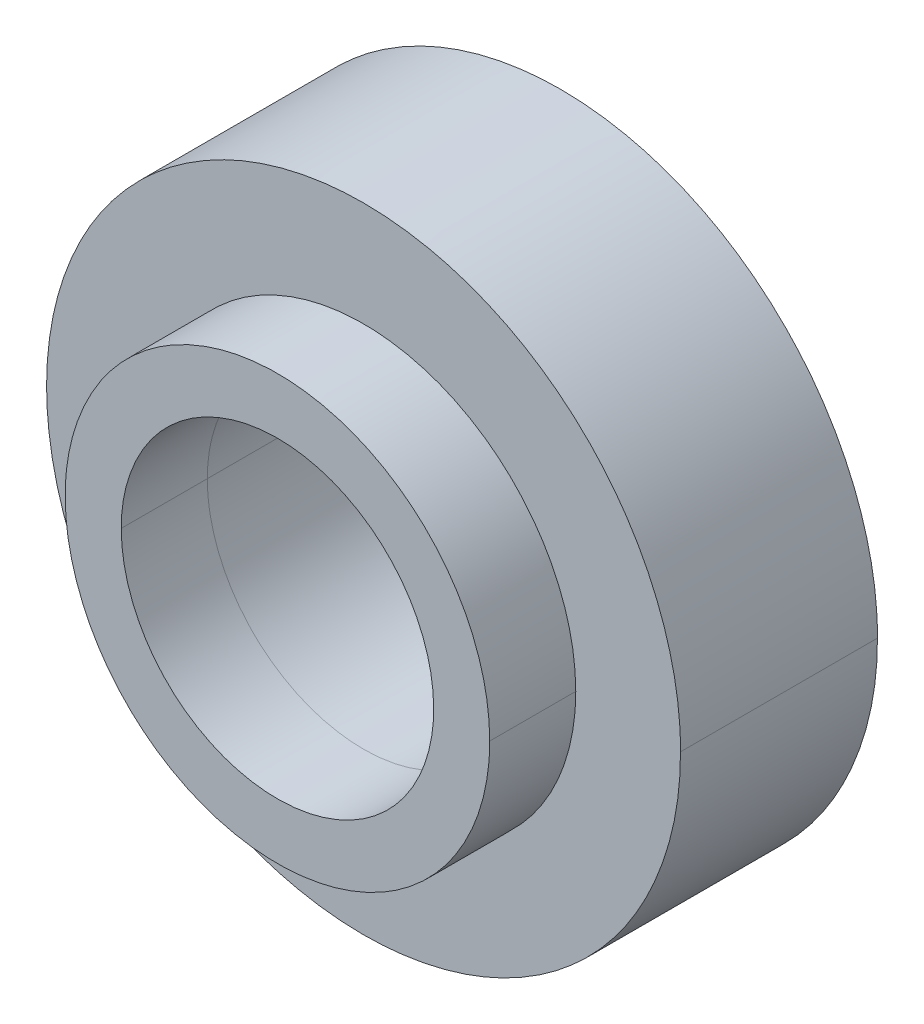
ISO-10303-21;
HEADER;
FILE_DESCRIPTION(('STEP AP214'),'2;1');
FILE_NAME('part.step','',(''),(''),'','','');
FILE_SCHEMA(('AUTOMOTIVE_DESIGN { 1 0 10303 214 1 1 1 1 }'));
ENDSEC;
DATA;
#1=APPLICATION_CONTEXT('core data for automotive mechanical design processes');
#2=APPLICATION_PROTOCOL_DEFINITION('international standard','automotive_design',2000,#1);
#3=PRODUCT_CONTEXT('',#1,'mechanical');
#4=PRODUCT('Part','Part','',(#3));
#5=PRODUCT_RELATED_PRODUCT_CATEGORY('part','',(#4));
#6=PRODUCT_DEFINITION_FORMATION('','',#4);
#7=PRODUCT_DEFINITION_CONTEXT('part definition',#1,'design');
#8=PRODUCT_DEFINITION('design','',#6,#7);
#9=PRODUCT_DEFINITION_SHAPE('','',#8);
#10=(LENGTH_UNIT() NAMED_UNIT(*) SI_UNIT(.MILLI.,.METRE.));
#11=(NAMED_UNIT(*) PLANE_ANGLE_UNIT() SI_UNIT($,.RADIAN.));
#12=(NAMED_UNIT(*) SI_UNIT($,.STERADIAN.) SOLID_ANGLE_UNIT());
#13=UNCERTAINTY_MEASURE_WITH_UNIT(LENGTH_MEASURE(1.E-05),#10,'distance_accuracy_value','');
#14=(GEOMETRIC_REPRESENTATION_CONTEXT(3) GLOBAL_UNCERTAINTY_ASSIGNED_CONTEXT((#13)) GLOBAL_UNIT_ASSIGNED_CONTEXT((#10,
#11,#12)) REPRESENTATION_CONTEXT('',''));
#15=CARTESIAN_POINT('',(0.,0.,0.));
#16=DIRECTION('',(0.,0.,1.));
#17=DIRECTION('',(1.,0.,0.));
#18=AXIS2_PLACEMENT_3D('',#15,#16,#17);
#19=CARTESIAN_POINT('',(388.289799999992,295.687749999996,40.9956));
#20=CARTESIAN_POINT('',(388.289799999991,296.060113055016,40.9956));
#21=CARTESIAN_POINT('',(388.407752994343,296.804839165051,40.9956));
#22=CARTESIAN_POINT('',(388.921222688105,297.812579931764,40.9956));
#23=CARTESIAN_POINT('',(389.720969661226,298.612327250808,40.9956));
#24=CARTESIAN_POINT('',(390.728712524096,299.125797656962,40.9956));
#25=CARTESIAN_POINT('',(391.845793650406,299.302723952994,40.9956));
#26=CARTESIAN_POINT('',(392.962912874279,299.125806531011,40.9956));
#27=CARTESIAN_POINT('',(393.970541444514,298.612291754613,40.9956));
#28=CARTESIAN_POINT('',(394.77070749061,297.812713042496,40.9956));
#29=CARTESIAN_POINT('',(395.28261518503,296.804342218297,40.9956));
#30=CARTESIAN_POINT('',(395.404454128956,296.061183856966,40.9956));
#31=CARTESIAN_POINT('',(395.4018,295.68775,40.9956));
#32=(BOUNDED_CURVE() B_SPLINE_CURVE(3,(#19,#20,#21,#22,#23,#24,#25,#26,#27,#28,#29,#30,#31),
.UNSPECIFIED.,.F.,.F.) B_SPLINE_CURVE_WITH_KNOTS((4,1,1,1,1,1,1,1,1,1,4),(0.438016502113,
0.481818152324,0.525619802535,0.569421452746,0.613223102958,0.657024753169,0.70082640338,
0.744628053591,0.788429703803,0.832231354014,0.876033004225),
.UNSPECIFIED.) CURVE() GEOMETRIC_REPRESENTATION_ITEM() RATIONAL_B_SPLINE_CURVE((1.,1.,1.,1.,1.,
1.,1.,1.,1.,1.,1.,1.,1.)) REPRESENTATION_ITEM(''));
#33=DIRECTION('',(0.,0.,1.));
#34=VECTOR('',#33,1.);
#35=SURFACE_OF_LINEAR_EXTRUSION('',#32,#34);
#36=DIRECTION('',(0.,0.,1.));
#37=VECTOR('',#36,1.);
#38=CARTESIAN_POINT('',(395.4018,295.68775,40.9956));
#39=LINE('',#38,#37);
#40=CARTESIAN_POINT('',(395.4018,295.68775,38.7858));
#41=VERTEX_POINT('',#40);
#42=CARTESIAN_POINT('',(395.4018,295.68775,40.9956));
#43=VERTEX_POINT('',#42);
#44=EDGE_CURVE('E11',#41,#43,#39,.T.);
#45=ORIENTED_EDGE('',*,*,#44,.F.);
#46=CARTESIAN_POINT('',(388.289799999992,295.687749999996,38.7858));
#47=CARTESIAN_POINT('',(388.289799999991,296.060113055016,38.7858));
#48=CARTESIAN_POINT('',(388.407752994343,296.804839165051,38.7858));
#49=CARTESIAN_POINT('',(388.921222688105,297.812579931764,38.7858));
#50=CARTESIAN_POINT('',(389.720969661226,298.612327250808,38.7858));
#51=CARTESIAN_POINT('',(390.728712524096,299.125797656962,38.7858));
#52=CARTESIAN_POINT('',(391.845793650406,299.302723952994,38.7858));
#53=CARTESIAN_POINT('',(392.962912874279,299.125806531011,38.7858));
#54=CARTESIAN_POINT('',(393.970541444514,298.612291754613,38.7858));
#55=CARTESIAN_POINT('',(394.77070749061,297.812713042496,38.7858));
#56=CARTESIAN_POINT('',(395.28261518503,296.804342218297,38.7858));
#57=CARTESIAN_POINT('',(395.404454128956,296.061183856966,38.7858));
#58=CARTESIAN_POINT('',(395.4018,295.68775,38.7858));
#59=(BOUNDED_CURVE() B_SPLINE_CURVE(3,(#46,#47,#48,#49,#50,#51,#52,#53,#54,#55,#56,#57,#58),
.UNSPECIFIED.,.F.,.F.) B_SPLINE_CURVE_WITH_KNOTS((4,1,1,1,1,1,1,1,1,1,4),(0.438016502113,
0.481818152324,0.525619802535,0.569421452746,0.613223102958,0.657024753169,0.70082640338,
0.744628053591,0.788429703803,0.832231354014,0.876033004225),
.UNSPECIFIED.) CURVE() GEOMETRIC_REPRESENTATION_ITEM() RATIONAL_B_SPLINE_CURVE((1.,1.,1.,1.,1.,
1.,1.,1.,1.,1.,1.,1.,1.)) REPRESENTATION_ITEM(''));
#60=CARTESIAN_POINT('',(388.289799999992,295.687749999996,38.7858));
#61=VERTEX_POINT('',#60);
#62=EDGE_CURVE('E215',#61,#41,#59,.T.);
#63=ORIENTED_EDGE('',*,*,#62,.F.);
#64=DIRECTION('',(0.,0.,1.));
#65=VECTOR('',#64,1.);
#66=CARTESIAN_POINT('',(388.289799999992,295.687749999996,40.9956));
#67=LINE('',#66,#65);
#68=CARTESIAN_POINT('',(388.289799999992,295.687749999996,40.9956));
#69=VERTEX_POINT('',#68);
#70=EDGE_CURVE('E28',#61,#69,#67,.T.);
#71=ORIENTED_EDGE('',*,*,#70,.T.);
#72=CARTESIAN_POINT('',(388.289799999992,295.687749999996,40.9956));
#73=CARTESIAN_POINT('',(388.289799999991,296.060113055016,40.9956));
#74=CARTESIAN_POINT('',(388.407752994343,296.804839165051,40.9956));
#75=CARTESIAN_POINT('',(388.921222688105,297.812579931764,40.9956));
#76=CARTESIAN_POINT('',(389.720969661226,298.612327250808,40.9956));
#77=CARTESIAN_POINT('',(390.728712524096,299.125797656962,40.9956));
#78=CARTESIAN_POINT('',(391.845793650406,299.302723952994,40.9956));
#79=CARTESIAN_POINT('',(392.962912874279,299.125806531011,40.9956));
#80=CARTESIAN_POINT('',(393.970541444514,298.612291754613,40.9956));
#81=CARTESIAN_POINT('',(394.77070749061,297.812713042496,40.9956));
#82=CARTESIAN_POINT('',(395.28261518503,296.804342218297,40.9956));
#83=CARTESIAN_POINT('',(395.404454128956,296.061183856966,40.9956));
#84=CARTESIAN_POINT('',(395.4018,295.68775,40.9956));
#85=(BOUNDED_CURVE() B_SPLINE_CURVE(3,(#72,#73,#74,#75,#76,#77,#78,#79,#80,#81,#82,#83,#84),
.UNSPECIFIED.,.F.,.F.) B_SPLINE_CURVE_WITH_KNOTS((4,1,1,1,1,1,1,1,1,1,4),(0.438016502113,
0.481818152324,0.525619802535,0.569421452746,0.613223102958,0.657024753169,0.70082640338,
0.744628053591,0.788429703803,0.832231354014,0.876033004225),
.UNSPECIFIED.) CURVE() GEOMETRIC_REPRESENTATION_ITEM() RATIONAL_B_SPLINE_CURVE((1.,1.,1.,1.,1.,
1.,1.,1.,1.,1.,1.,1.,1.)) REPRESENTATION_ITEM(''));
#86=EDGE_CURVE('E218',#43,#69,#85,.F.);
#87=ORIENTED_EDGE('',*,*,#86,.F.);
#88=EDGE_LOOP('',(#45,#63,#71,#87));
#89=FACE_BOUND('',#88,.T.);
#90=ADVANCED_FACE('F17',(#89),#35,.F.);
#91=CARTESIAN_POINT('',(394.22705,295.687750000011,40.9956));
#92=CARTESIAN_POINT('',(394.227049999999,295.937100260063,40.9956));
#93=CARTESIAN_POINT('',(394.148063619846,296.435800780176,40.9956));
#94=CARTESIAN_POINT('',(393.804222307074,297.110627186447,40.9956));
#95=CARTESIAN_POINT('',(393.268677459015,297.64617226618,40.9956));
#96=CARTESIAN_POINT('',(392.593849649034,297.990014055991,40.9956));
#97=CARTESIAN_POINT('',(391.84580425196,298.108491486397,40.9956));
#98=CARTESIAN_POINT('',(391.097733343126,297.990019998448,40.9956));
#99=CARTESIAN_POINT('',(390.4229820684,297.646148496403,40.9956));
#100=CARTESIAN_POINT('',(389.887156591107,297.110716323099,40.9956));
#101=CARTESIAN_POINT('',(389.544361260011,296.435468003316,40.9956));
#102=CARTESIAN_POINT('',(389.462772681507,295.937817314952,40.9956));
#103=CARTESIAN_POINT('',(389.46455,295.68775,40.9956));
#104=(BOUNDED_CURVE() B_SPLINE_CURVE(3,(#91,#92,#93,#94,#95,#96,#97,#98,#99,#100,#101,#102,
#103),.UNSPECIFIED.,.F.,.F.) B_SPLINE_CURVE_WITH_KNOTS((4,1,1,1,1,1,1,1,1,1,4),(0.29331462195,
0.322646084145,0.351977546341,0.381309008536,0.410640470731,0.439971932926,0.469303395121,
0.498634857316,0.527966319511,0.557297781706,0.586629243901),
.UNSPECIFIED.) CURVE() GEOMETRIC_REPRESENTATION_ITEM() RATIONAL_B_SPLINE_CURVE((1.,1.,1.,1.,1.,
1.,1.,1.,1.,1.,1.,1.,1.)) REPRESENTATION_ITEM(''));
#105=DIRECTION('',(0.,0.,-1.));
#106=VECTOR('',#105,1.);
#107=SURFACE_OF_LINEAR_EXTRUSION('',#104,#106);
#108=DIRECTION('',(0.,0.,-1.));
#109=VECTOR('',#108,1.);
#110=CARTESIAN_POINT('',(389.46455,295.68775,40.9956));
#111=LINE('',#110,#109);
#112=CARTESIAN_POINT('',(389.46455,295.68775,41.9608));
#113=VERTEX_POINT('',#112);
#114=CARTESIAN_POINT('',(389.46455,295.68775,40.9956));
#115=VERTEX_POINT('',#114);
#116=EDGE_CURVE('E179',#113,#115,#111,.T.);
#117=ORIENTED_EDGE('',*,*,#116,.F.);
#118=CARTESIAN_POINT('',(394.22705,295.687750000011,41.9608));
#119=CARTESIAN_POINT('',(394.227049999999,295.937100260063,41.9608));
#120=CARTESIAN_POINT('',(394.148063619846,296.435800780176,41.9608));
#121=CARTESIAN_POINT('',(393.804222307074,297.110627186447,41.9608));
#122=CARTESIAN_POINT('',(393.268677459015,297.64617226618,41.9608));
#123=CARTESIAN_POINT('',(392.593849649034,297.990014055991,41.9608));
#124=CARTESIAN_POINT('',(391.84580425196,298.108491486397,41.9608));
#125=CARTESIAN_POINT('',(391.097733343126,297.990019998448,41.9608));
#126=CARTESIAN_POINT('',(390.4229820684,297.646148496403,41.9608));
#127=CARTESIAN_POINT('',(389.887156591107,297.110716323099,41.9608));
#128=CARTESIAN_POINT('',(389.544361260011,296.435468003316,41.9608));
#129=CARTESIAN_POINT('',(389.462772681507,295.937817314952,41.9608));
#130=CARTESIAN_POINT('',(389.46455,295.68775,41.9608));
#131=(BOUNDED_CURVE() B_SPLINE_CURVE(3,(#118,#119,#120,#121,#122,#123,#124,#125,#126,#127,#128,
#129,#130),.UNSPECIFIED.,.F.,.F.) B_SPLINE_CURVE_WITH_KNOTS((4,1,1,1,1,1,1,1,1,1,4),
(0.29331462195,0.322646084145,0.351977546341,0.381309008536,0.410640470731,0.439971932926,
0.469303395121,0.498634857316,0.527966319511,0.557297781706,0.586629243901),
.UNSPECIFIED.) CURVE() GEOMETRIC_REPRESENTATION_ITEM() RATIONAL_B_SPLINE_CURVE((1.,1.,1.,1.,1.,
1.,1.,1.,1.,1.,1.,1.,1.)) REPRESENTATION_ITEM(''));
#132=CARTESIAN_POINT('',(394.22705,295.687750000011,41.9608));
#133=VERTEX_POINT('',#132);
#134=EDGE_CURVE('E111',#133,#113,#131,.T.);
#135=ORIENTED_EDGE('',*,*,#134,.F.);
#136=DIRECTION('',(0.,0.,-1.));
#137=VECTOR('',#136,1.);
#138=CARTESIAN_POINT('',(394.22705,295.687750000011,40.9956));
#139=LINE('',#138,#137);
#140=CARTESIAN_POINT('',(394.22705,295.687750000011,40.9956));
#141=VERTEX_POINT('',#140);
#142=EDGE_CURVE('E148',#133,#141,#139,.T.);
#143=ORIENTED_EDGE('',*,*,#142,.T.);
#144=CARTESIAN_POINT('',(394.22705,295.687750000011,40.9956));
#145=CARTESIAN_POINT('',(394.227049999999,295.937100260063,40.9956));
#146=CARTESIAN_POINT('',(394.148063619846,296.435800780176,40.9956));
#147=CARTESIAN_POINT('',(393.804222307074,297.110627186447,40.9956));
#148=CARTESIAN_POINT('',(393.268677459015,297.64617226618,40.9956));
#149=CARTESIAN_POINT('',(392.593849649034,297.990014055991,40.9956));
#150=CARTESIAN_POINT('',(391.84580425196,298.108491486397,40.9956));
#151=CARTESIAN_POINT('',(391.097733343126,297.990019998448,40.9956));
#152=CARTESIAN_POINT('',(390.4229820684,297.646148496403,40.9956));
#153=CARTESIAN_POINT('',(389.887156591107,297.110716323099,40.9956));
#154=CARTESIAN_POINT('',(389.544361260011,296.435468003316,40.9956));
#155=CARTESIAN_POINT('',(389.462772681507,295.937817314952,40.9956));
#156=CARTESIAN_POINT('',(389.46455,295.68775,40.9956));
#157=(BOUNDED_CURVE() B_SPLINE_CURVE(3,(#144,#145,#146,#147,#148,#149,#150,#151,#152,#153,#154,
#155,#156),.UNSPECIFIED.,.F.,.F.) B_SPLINE_CURVE_WITH_KNOTS((4,1,1,1,1,1,1,1,1,1,4),
(0.29331462195,0.322646084145,0.351977546341,0.381309008536,0.410640470731,0.439971932926,
0.469303395121,0.498634857316,0.527966319511,0.557297781706,0.586629243901),
.UNSPECIFIED.) CURVE() GEOMETRIC_REPRESENTATION_ITEM() RATIONAL_B_SPLINE_CURVE((1.,1.,1.,1.,1.,
1.,1.,1.,1.,1.,1.,1.,1.)) REPRESENTATION_ITEM(''));
#158=EDGE_CURVE('E244',#141,#115,#157,.T.);
#159=ORIENTED_EDGE('',*,*,#158,.T.);
#160=EDGE_LOOP('',(#117,#135,#143,#159));
#161=FACE_BOUND('',#160,.T.);
#162=ADVANCED_FACE('F168',(#161),#107,.F.);
#163=CARTESIAN_POINT('',(393.5984,295.68775,40.9956));
#164=CARTESIAN_POINT('',(393.599708106426,295.503700456213,40.9956));
#165=CARTESIAN_POINT('',(393.539658912631,295.137429549564,40.9956));
#166=CARTESIAN_POINT('',(393.287361548951,294.640446786203,40.9956));
#167=CARTESIAN_POINT('',(392.892993997658,294.246368706644,40.9956));
#168=CARTESIAN_POINT('',(392.396377059448,293.99327928115,40.9956));
#169=CARTESIAN_POINT('',(391.845796870568,293.906084266031,40.9956));
#170=CARTESIAN_POINT('',(391.295235458307,293.993283654776,40.9956));
#171=CARTESIAN_POINT('',(390.798562190162,294.24635121209,40.9956));
#172=CARTESIAN_POINT('',(390.404401181991,294.640512390771,40.9956));
#173=CARTESIAN_POINT('',(390.151333975783,295.137184625793,40.9956));
#174=CARTESIAN_POINT('',(390.0932,295.504228208596,40.9956));
#175=CARTESIAN_POINT('',(390.0932,295.687749999996,40.9956));
#176=(BOUNDED_CURVE() B_SPLINE_CURVE(3,(#163,#164,#165,#166,#167,#168,#169,#170,#171,#172,#173,
#174,#175),.UNSPECIFIED.,.F.,.F.) B_SPLINE_CURVE_WITH_KNOTS((4,1,1,1,1,1,1,1,1,1,4),(0.,
0.02158795617555,0.0431759123511,0.06476386852666,0.08635182470221,0.107939780878,
0.129527737053,0.151115693229,0.172703649404,0.19429160558,0.215879561756),
.UNSPECIFIED.) CURVE() GEOMETRIC_REPRESENTATION_ITEM() RATIONAL_B_SPLINE_CURVE((1.,1.,1.,1.,1.,
1.,1.,1.,1.,1.,1.,1.,1.)) REPRESENTATION_ITEM(''));
#177=DIRECTION('',(0.,0.,1.));
#178=VECTOR('',#177,1.);
#179=SURFACE_OF_LINEAR_EXTRUSION('',#176,#178);
#180=DIRECTION('',(0.,0.,1.));
#181=VECTOR('',#180,1.);
#182=CARTESIAN_POINT('',(393.5984,295.68775,40.9956));
#183=LINE('',#182,#181);
#184=CARTESIAN_POINT('',(393.5984,295.68775,38.7858));
#185=VERTEX_POINT('',#184);
#186=CARTESIAN_POINT('',(393.5984,295.68775,40.9956));
#187=VERTEX_POINT('',#186);
#188=EDGE_CURVE('E90',#185,#187,#183,.T.);
#189=ORIENTED_EDGE('',*,*,#188,.F.);
#190=CARTESIAN_POINT('',(393.5984,295.68775,38.7858));
#191=CARTESIAN_POINT('',(393.599708106426,295.503700456213,38.7858));
#192=CARTESIAN_POINT('',(393.539658912631,295.137429549564,38.7858));
#193=CARTESIAN_POINT('',(393.287361548951,294.640446786203,38.7858));
#194=CARTESIAN_POINT('',(392.892993997658,294.246368706644,38.7858));
#195=CARTESIAN_POINT('',(392.396377059448,293.99327928115,38.7858));
#196=CARTESIAN_POINT('',(391.845796870568,293.906084266031,38.7858));
#197=CARTESIAN_POINT('',(391.295235458307,293.993283654776,38.7858));
#198=CARTESIAN_POINT('',(390.798562190162,294.24635121209,38.7858));
#199=CARTESIAN_POINT('',(390.404401181991,294.640512390771,38.7858));
#200=CARTESIAN_POINT('',(390.151333975783,295.137184625793,38.7858));
#201=CARTESIAN_POINT('',(390.0932,295.504228208596,38.7858));
#202=CARTESIAN_POINT('',(390.0932,295.687749999996,38.7858));
#203=(BOUNDED_CURVE() B_SPLINE_CURVE(3,(#190,#191,#192,#193,#194,#195,#196,#197,#198,#199,#200,
#201,#202),.UNSPECIFIED.,.F.,.F.) B_SPLINE_CURVE_WITH_KNOTS((4,1,1,1,1,1,1,1,1,1,4),(0.,
0.02158795617555,0.0431759123511,0.06476386852666,0.08635182470221,0.107939780878,
0.129527737053,0.151115693229,0.172703649404,0.19429160558,0.215879561756),
.UNSPECIFIED.) CURVE() GEOMETRIC_REPRESENTATION_ITEM() RATIONAL_B_SPLINE_CURVE((1.,1.,1.,1.,1.,
1.,1.,1.,1.,1.,1.,1.,1.)) REPRESENTATION_ITEM(''));
#204=CARTESIAN_POINT('',(390.0932,295.687749999996,38.7858));
#205=VERTEX_POINT('',#204);
#206=EDGE_CURVE('E85',#205,#185,#203,.F.);
#207=ORIENTED_EDGE('',*,*,#206,.F.);
#208=DIRECTION('',(0.,0.,1.));
#209=VECTOR('',#208,1.);
#210=CARTESIAN_POINT('',(390.0932,295.687749999996,40.9956));
#211=LINE('',#210,#209);
#212=CARTESIAN_POINT('',(390.0932,295.68775,40.9956));
#213=VERTEX_POINT('',#212);
#214=EDGE_CURVE('E77',#205,#213,#211,.T.);
#215=ORIENTED_EDGE('',*,*,#214,.T.);
#216=CARTESIAN_POINT('',(390.0932,295.687749999996,40.9956));
#217=CARTESIAN_POINT('',(390.0932,295.504228208596,40.9956));
#218=CARTESIAN_POINT('',(390.151333975783,295.137184625793,40.9956));
#219=CARTESIAN_POINT('',(390.404401181991,294.640512390771,40.9956));
#220=CARTESIAN_POINT('',(390.798562190162,294.24635121209,40.9956));
#221=CARTESIAN_POINT('',(391.295235458307,293.993283654776,40.9956));
#222=CARTESIAN_POINT('',(391.845796870568,293.906084266031,40.9956));
#223=CARTESIAN_POINT('',(392.396377059448,293.99327928115,40.9956));
#224=CARTESIAN_POINT('',(392.892993997658,294.246368706644,40.9956));
#225=CARTESIAN_POINT('',(393.287361548951,294.640446786203,40.9956));
#226=CARTESIAN_POINT('',(393.539658912631,295.137429549564,40.9956));
#227=CARTESIAN_POINT('',(393.599708106426,295.503700456213,40.9956));
#228=CARTESIAN_POINT('',(393.5984,295.68775,40.9956));
#229=(BOUNDED_CURVE() B_SPLINE_CURVE(3,(#216,#217,#218,#219,#220,#221,#222,#223,#224,#225,#226,
#227,#228),.UNSPECIFIED.,.F.,.F.) B_SPLINE_CURVE_WITH_KNOTS((4,1,1,1,1,1,1,1,1,1,4),(0.,
0.021587956176,0.043175912352,0.064763868527,0.086351824703,0.107939780878,0.12952773705379,
0.15111569322934,0.1727036494049,0.19429160558045,0.215879561756),
.UNSPECIFIED.) CURVE() GEOMETRIC_REPRESENTATION_ITEM() RATIONAL_B_SPLINE_CURVE((1.,1.,1.,1.,1.,
1.,1.,1.,1.,1.,1.,1.,1.)) REPRESENTATION_ITEM(''));
#230=EDGE_CURVE('E81',#213,#187,#229,.T.);
#231=ORIENTED_EDGE('',*,*,#230,.T.);
#232=EDGE_LOOP('',(#189,#207,#215,#231));
#233=FACE_BOUND('',#232,.T.);
#234=ADVANCED_FACE('F79',(#233),#179,.T.);
#235=CARTESIAN_POINT('',(390.0932,295.68775,40.9956));
#236=CARTESIAN_POINT('',(390.091891893574,295.503700456213,40.9956));
#237=CARTESIAN_POINT('',(390.151941087369,295.137429549564,40.9956));
#238=CARTESIAN_POINT('',(390.404238451049,294.640446786203,40.9956));
#239=CARTESIAN_POINT('',(390.798606002342,294.246368706644,40.9956));
#240=CARTESIAN_POINT('',(391.295222940552,293.99327928115,40.9956));
#241=CARTESIAN_POINT('',(391.845803129432,293.906084266031,40.9956));
#242=CARTESIAN_POINT('',(392.396364541693,293.993283654776,40.9956));
#243=CARTESIAN_POINT('',(392.893037809838,294.24635121209,40.9956));
#244=CARTESIAN_POINT('',(393.287198818009,294.640512390771,40.9956));
#245=CARTESIAN_POINT('',(393.540266024216,295.137184625793,40.9956));
#246=CARTESIAN_POINT('',(393.5984,295.504228208596,40.9956));
#247=CARTESIAN_POINT('',(393.5984,295.687749999996,40.9956));
#248=(BOUNDED_CURVE() B_SPLINE_CURVE(3,(#235,#236,#237,#238,#239,#240,#241,#242,#243,#244,#245,
#246,#247),.UNSPECIFIED.,.F.,.F.) B_SPLINE_CURVE_WITH_KNOTS((4,1,1,1,1,1,1,1,1,1,4),(0.,
0.02158795617555,0.0431759123511,0.06476386852666,0.08635182470221,0.107939780878,
0.129527737053,0.151115693229,0.172703649404,0.19429160558,0.215879561756),
.UNSPECIFIED.) CURVE() GEOMETRIC_REPRESENTATION_ITEM() RATIONAL_B_SPLINE_CURVE((1.,1.,1.,1.,1.,
1.,1.,1.,1.,1.,1.,1.,1.)) REPRESENTATION_ITEM(''));
#249=DIRECTION('',(0.,0.,-1.));
#250=VECTOR('',#249,1.);
#251=SURFACE_OF_LINEAR_EXTRUSION('',#248,#250);
#252=DIRECTION('',(0.,0.,-1.));
#253=VECTOR('',#252,1.);
#254=CARTESIAN_POINT('',(390.0932,295.68775,40.9956));
#255=LINE('',#254,#253);
#256=CARTESIAN_POINT('',(390.0932,295.68775,41.9608));
#257=VERTEX_POINT('',#256);
#258=EDGE_CURVE('E91',#257,#213,#255,.T.);
#259=ORIENTED_EDGE('',*,*,#258,.F.);
#260=CARTESIAN_POINT('',(390.0932,295.68775,41.9608));
#261=CARTESIAN_POINT('',(390.091891893574,295.503700456213,41.9608));
#262=CARTESIAN_POINT('',(390.151941087369,295.137429549564,41.9608));
#263=CARTESIAN_POINT('',(390.404238451049,294.640446786203,41.9608));
#264=CARTESIAN_POINT('',(390.798606002342,294.246368706644,41.9608));
#265=CARTESIAN_POINT('',(391.295222940552,293.99327928115,41.9608));
#266=CARTESIAN_POINT('',(391.845803129432,293.906084266031,41.9608));
#267=CARTESIAN_POINT('',(392.396364541693,293.993283654776,41.9608));
#268=CARTESIAN_POINT('',(392.893037809838,294.24635121209,41.9608));
#269=CARTESIAN_POINT('',(393.287198818009,294.640512390771,41.9608));
#270=CARTESIAN_POINT('',(393.540266024216,295.137184625793,41.9608));
#271=CARTESIAN_POINT('',(393.5984,295.504228208596,41.9608));
#272=CARTESIAN_POINT('',(393.5984,295.687749999996,41.9608));
#273=(BOUNDED_CURVE() B_SPLINE_CURVE(3,(#260,#261,#262,#263,#264,#265,#266,#267,#268,#269,#270,
#271,#272),.UNSPECIFIED.,.F.,.F.) B_SPLINE_CURVE_WITH_KNOTS((4,1,1,1,1,1,1,1,1,1,4),(0.,
0.02158795617555,0.0431759123511,0.06476386852666,0.08635182470221,0.107939780878,
0.129527737053,0.151115693229,0.172703649404,0.19429160558,0.215879561756),
.UNSPECIFIED.) CURVE() GEOMETRIC_REPRESENTATION_ITEM() RATIONAL_B_SPLINE_CURVE((1.,1.,1.,1.,1.,
1.,1.,1.,1.,1.,1.,1.,1.)) REPRESENTATION_ITEM(''));
#274=CARTESIAN_POINT('',(393.5984,295.687749999996,41.9608));
#275=VERTEX_POINT('',#274);
#276=EDGE_CURVE('E286',#275,#257,#273,.F.);
#277=ORIENTED_EDGE('',*,*,#276,.F.);
#278=DIRECTION('',(0.,0.,-1.));
#279=VECTOR('',#278,1.);
#280=CARTESIAN_POINT('',(393.5984,295.687749999996,40.9956));
#281=LINE('',#280,#279);
#282=EDGE_CURVE('E102',#275,#187,#281,.T.);
#283=ORIENTED_EDGE('',*,*,#282,.T.);
#284=ORIENTED_EDGE('',*,*,#230,.F.);
#285=EDGE_LOOP('',(#259,#277,#283,#284));
#286=FACE_BOUND('',#285,.T.);
#287=ADVANCED_FACE('F110',(#286),#251,.T.);
#288=CARTESIAN_POINT('',(393.5984,295.687749999996,40.9956));
#289=CARTESIAN_POINT('',(393.598400000001,295.871271791396,40.9956));
#290=CARTESIAN_POINT('',(393.54026602422,296.2383153742,40.9956));
#291=CARTESIAN_POINT('',(393.287198818009,296.734987609229,40.9956));
#292=CARTESIAN_POINT('',(392.893037809838,297.12914878791,40.9956));
#293=CARTESIAN_POINT('',(392.396364541693,297.382216345224,40.9956));
#294=CARTESIAN_POINT('',(391.845803129432,297.469415733969,40.9956));
#295=CARTESIAN_POINT('',(391.295222940552,297.38222071885,40.9956));
#296=CARTESIAN_POINT('',(390.798606002342,297.129131293356,40.9956));
#297=CARTESIAN_POINT('',(390.404238451049,296.735053213797,40.9956));
#298=CARTESIAN_POINT('',(390.151941087369,296.238070450436,40.9956));
#299=CARTESIAN_POINT('',(390.091891893574,295.871799543787,40.9956));
#300=CARTESIAN_POINT('',(390.0932,295.68775,40.9956));
#301=(BOUNDED_CURVE() B_SPLINE_CURVE(3,(#288,#289,#290,#291,#292,#293,#294,#295,#296,#297,#298,
#299,#300),.UNSPECIFIED.,.F.,.F.) B_SPLINE_CURVE_WITH_KNOTS((4,1,1,1,1,1,1,1,1,1,4),
(0.215879561756,0.237467517931,0.259055474107,0.280643430282,0.302231386458,0.323819342633,
0.345407298809,0.366995254984,0.38858321116,0.410171167335,0.431759123511),
.UNSPECIFIED.) CURVE() GEOMETRIC_REPRESENTATION_ITEM() RATIONAL_B_SPLINE_CURVE((1.,1.,1.,1.,1.,
1.,1.,1.,1.,1.,1.,1.,1.)) REPRESENTATION_ITEM(''));
#302=DIRECTION('',(0.,0.,-1.));
#303=VECTOR('',#302,1.);
#304=SURFACE_OF_LINEAR_EXTRUSION('',#301,#303);
#305=CARTESIAN_POINT('',(393.5984,295.687749999996,41.9608));
#306=CARTESIAN_POINT('',(393.598400000001,295.871271791396,41.9608));
#307=CARTESIAN_POINT('',(393.54026602422,296.2383153742,41.9608));
#308=CARTESIAN_POINT('',(393.287198818009,296.734987609229,41.9608));
#309=CARTESIAN_POINT('',(392.893037809838,297.12914878791,41.9608));
#310=CARTESIAN_POINT('',(392.396364541693,297.382216345224,41.9608));
#311=CARTESIAN_POINT('',(391.845803129432,297.469415733969,41.9608));
#312=CARTESIAN_POINT('',(391.295222940552,297.38222071885,41.9608));
#313=CARTESIAN_POINT('',(390.798606002342,297.129131293356,41.9608));
#314=CARTESIAN_POINT('',(390.404238451049,296.735053213797,41.9608));
#315=CARTESIAN_POINT('',(390.151941087369,296.238070450436,41.9608));
#316=CARTESIAN_POINT('',(390.091891893574,295.871799543787,41.9608));
#317=CARTESIAN_POINT('',(390.0932,295.68775,41.9608));
#318=(BOUNDED_CURVE() B_SPLINE_CURVE(3,(#305,#306,#307,#308,#309,#310,#311,#312,#313,#314,#315,
#316,#317),.UNSPECIFIED.,.F.,.F.) B_SPLINE_CURVE_WITH_KNOTS((4,1,1,1,1,1,1,1,1,1,4),
(0.215879561756,0.237467517931,0.259055474107,0.280643430282,0.302231386458,0.323819342633,
0.345407298809,0.366995254984,0.38858321116,0.410171167335,0.431759123511),
.UNSPECIFIED.) CURVE() GEOMETRIC_REPRESENTATION_ITEM() RATIONAL_B_SPLINE_CURVE((1.,1.,1.,1.,1.,
1.,1.,1.,1.,1.,1.,1.,1.)) REPRESENTATION_ITEM(''));
#319=EDGE_CURVE('E98',#257,#275,#318,.F.);
#320=ORIENTED_EDGE('',*,*,#319,.F.);
#321=ORIENTED_EDGE('',*,*,#258,.T.);
#322=CARTESIAN_POINT('',(393.5984,295.68775,40.9956));
#323=CARTESIAN_POINT('',(393.599708106426,295.871799543787,40.9956));
#324=CARTESIAN_POINT('',(393.539658912631,296.238070450436,40.9956));
#325=CARTESIAN_POINT('',(393.287361548951,296.735053213797,40.9956));
#326=CARTESIAN_POINT('',(392.892993997658,297.129131293356,40.9956));
#327=CARTESIAN_POINT('',(392.396377059448,297.38222071885,40.9956));
#328=CARTESIAN_POINT('',(391.845796870568,297.469415733969,40.9956));
#329=CARTESIAN_POINT('',(391.295235458307,297.382216345224,40.9956));
#330=CARTESIAN_POINT('',(390.798562190162,297.12914878791,40.9956));
#331=CARTESIAN_POINT('',(390.404401181991,296.734987609229,40.9956));
#332=CARTESIAN_POINT('',(390.15133397578,296.2383153742,40.9956));
#333=CARTESIAN_POINT('',(390.093199999999,295.871271791396,40.9956));
#334=CARTESIAN_POINT('',(390.0932,295.687749999996,40.9956));
#335=(BOUNDED_CURVE() B_SPLINE_CURVE(3,(#322,#323,#324,#325,#326,#327,#328,#329,#330,#331,#332,
#333,#334),.UNSPECIFIED.,.F.,.F.) B_SPLINE_CURVE_WITH_KNOTS((4,1,1,1,1,1,1,1,1,1,4),
(0.215879561756,0.237467517932,0.259055474107,0.280643430283,0.302231386458,0.323819342634,
0.345407298809,0.366995254985,0.38858321116,0.410171167336,0.431759123511),
.UNSPECIFIED.) CURVE() GEOMETRIC_REPRESENTATION_ITEM() RATIONAL_B_SPLINE_CURVE((1.,1.,1.,1.,1.,
1.,1.,1.,1.,1.,1.,1.,1.)) REPRESENTATION_ITEM(''));
#336=EDGE_CURVE('E96',#187,#213,#335,.T.);
#337=ORIENTED_EDGE('',*,*,#336,.F.);
#338=ORIENTED_EDGE('',*,*,#282,.F.);
#339=EDGE_LOOP('',(#320,#321,#337,#338));
#340=FACE_BOUND('',#339,.T.);
#341=ADVANCED_FACE('F95',(#340),#304,.T.);
#342=CARTESIAN_POINT('',(391.847371605213,295.68775,41.9608));
#343=DIRECTION('',(0.,0.,1.));
#344=DIRECTION('',(0.,-1.,0.));
#345=AXIS2_PLACEMENT_3D('',#342,#343,#344);
#346=PLANE('',#345);
#347=ORIENTED_EDGE('',*,*,#319,.T.);
#348=ORIENTED_EDGE('',*,*,#276,.T.);
#349=EDGE_LOOP('',(#347,#348));
#350=FACE_BOUND('',#349,.T.);
#351=CARTESIAN_POINT('',(389.46455,295.68775,41.9608));
#352=CARTESIAN_POINT('',(389.462772681507,295.437682685048,41.9608));
#353=CARTESIAN_POINT('',(389.544361260011,294.940031996684,41.9608));
#354=CARTESIAN_POINT('',(389.887156591107,294.264783676901,41.9608));
#355=CARTESIAN_POINT('',(390.4229820684,293.729351503597,41.9608));
#356=CARTESIAN_POINT('',(391.097733343126,293.385480001552,41.9608));
#357=CARTESIAN_POINT('',(391.84580425196,293.267008513603,41.9608));
#358=CARTESIAN_POINT('',(392.593849649034,293.385485944009,41.9608));
#359=CARTESIAN_POINT('',(393.268677459015,293.72932773382,41.9608));
#360=CARTESIAN_POINT('',(393.804222307074,294.264872813553,41.9608));
#361=CARTESIAN_POINT('',(394.14806361985,294.939699219832,41.9608));
#362=CARTESIAN_POINT('',(394.227050000001,295.438399739951,41.9608));
#363=CARTESIAN_POINT('',(394.22705,295.687750000011,41.9608));
#364=(BOUNDED_CURVE() B_SPLINE_CURVE(3,(#351,#352,#353,#354,#355,#356,#357,#358,#359,#360,#361,
#362,#363),.UNSPECIFIED.,.F.,.F.) B_SPLINE_CURVE_WITH_KNOTS((4,1,1,1,1,1,1,1,1,1,4),(0.,
0.02933146219504,0.05866292439009,0.08799438658513,0.11732584878,0.146657310975,0.17598877317,
0.205320235365,0.23465169756,0.263983159755,0.29331462195),
.UNSPECIFIED.) CURVE() GEOMETRIC_REPRESENTATION_ITEM() RATIONAL_B_SPLINE_CURVE((1.,1.,1.,1.,1.,
1.,1.,1.,1.,1.,1.,1.,1.)) REPRESENTATION_ITEM(''));
#365=EDGE_CURVE('E265',#113,#133,#364,.T.);
#366=ORIENTED_EDGE('',*,*,#365,.T.);
#367=ORIENTED_EDGE('',*,*,#134,.T.);
#368=EDGE_LOOP('',(#366,#367));
#369=FACE_BOUND('',#368,.T.);
#370=ADVANCED_FACE('F296',(#350,#369),#346,.T.);
#371=CARTESIAN_POINT('',(390.0932,295.687749999996,40.9956));
#372=CARTESIAN_POINT('',(390.093199999999,295.871271791396,40.9956));
#373=CARTESIAN_POINT('',(390.15133397578,296.2383153742,40.9956));
#374=CARTESIAN_POINT('',(390.404401181991,296.734987609229,40.9956));
#375=CARTESIAN_POINT('',(390.798562190162,297.12914878791,40.9956));
#376=CARTESIAN_POINT('',(391.295235458307,297.382216345224,40.9956));
#377=CARTESIAN_POINT('',(391.845796870568,297.469415733969,40.9956));
#378=CARTESIAN_POINT('',(392.396377059448,297.38222071885,40.9956));
#379=CARTESIAN_POINT('',(392.892993997658,297.129131293356,40.9956));
#380=CARTESIAN_POINT('',(393.287361548951,296.735053213797,40.9956));
#381=CARTESIAN_POINT('',(393.539658912631,296.238070450436,40.9956));
#382=CARTESIAN_POINT('',(393.599708106426,295.871799543787,40.9956));
#383=CARTESIAN_POINT('',(393.5984,295.68775,40.9956));
#384=(BOUNDED_CURVE() B_SPLINE_CURVE(3,(#371,#372,#373,#374,#375,#376,#377,#378,#379,#380,#381,
#382,#383),.UNSPECIFIED.,.F.,.F.) B_SPLINE_CURVE_WITH_KNOTS((4,1,1,1,1,1,1,1,1,1,4),
(0.215879561756,0.237467517931,0.259055474107,0.280643430282,0.302231386458,0.323819342633,
0.345407298809,0.366995254984,0.38858321116,0.410171167335,0.431759123511),
.UNSPECIFIED.) CURVE() GEOMETRIC_REPRESENTATION_ITEM() RATIONAL_B_SPLINE_CURVE((1.,1.,1.,1.,1.,
1.,1.,1.,1.,1.,1.,1.,1.)) REPRESENTATION_ITEM(''));
#385=DIRECTION('',(0.,0.,1.));
#386=VECTOR('',#385,1.);
#387=SURFACE_OF_LINEAR_EXTRUSION('',#384,#386);
#388=CARTESIAN_POINT('',(390.0932,295.687749999996,38.7858));
#389=CARTESIAN_POINT('',(390.093199999999,295.871271791396,38.7858));
#390=CARTESIAN_POINT('',(390.15133397578,296.2383153742,38.7858));
#391=CARTESIAN_POINT('',(390.404401181991,296.734987609229,38.7858));
#392=CARTESIAN_POINT('',(390.798562190162,297.12914878791,38.7858));
#393=CARTESIAN_POINT('',(391.295235458307,297.382216345224,38.7858));
#394=CARTESIAN_POINT('',(391.845796870568,297.469415733969,38.7858));
#395=CARTESIAN_POINT('',(392.396377059448,297.38222071885,38.7858));
#396=CARTESIAN_POINT('',(392.892993997658,297.129131293356,38.7858));
#397=CARTESIAN_POINT('',(393.287361548951,296.735053213797,38.7858));
#398=CARTESIAN_POINT('',(393.539658912631,296.238070450436,38.7858));
#399=CARTESIAN_POINT('',(393.599708106426,295.871799543787,38.7858));
#400=CARTESIAN_POINT('',(393.5984,295.68775,38.7858));
#401=(BOUNDED_CURVE() B_SPLINE_CURVE(3,(#388,#389,#390,#391,#392,#393,#394,#395,#396,#397,#398,
#399,#400),.UNSPECIFIED.,.F.,.F.) B_SPLINE_CURVE_WITH_KNOTS((4,1,1,1,1,1,1,1,1,1,4),
(0.215879561756,0.237467517931,0.259055474107,0.280643430282,0.302231386458,0.323819342633,
0.345407298809,0.366995254984,0.38858321116,0.410171167335,0.431759123511),
.UNSPECIFIED.) CURVE() GEOMETRIC_REPRESENTATION_ITEM() RATIONAL_B_SPLINE_CURVE((1.,1.,1.,1.,1.,
1.,1.,1.,1.,1.,1.,1.,1.)) REPRESENTATION_ITEM(''));
#402=EDGE_CURVE('E252',#185,#205,#401,.F.);
#403=ORIENTED_EDGE('',*,*,#402,.F.);
#404=ORIENTED_EDGE('',*,*,#188,.T.);
#405=ORIENTED_EDGE('',*,*,#336,.T.);
#406=ORIENTED_EDGE('',*,*,#214,.F.);
#407=EDGE_LOOP('',(#403,#404,#405,#406));
#408=FACE_BOUND('',#407,.T.);
#409=ADVANCED_FACE('F105',(#408),#387,.T.);
#410=CARTESIAN_POINT('',(389.46455,295.68775,40.9956));
#411=CARTESIAN_POINT('',(389.462772681507,295.437682685048,40.9956));
#412=CARTESIAN_POINT('',(389.544361260011,294.940031996684,40.9956));
#413=CARTESIAN_POINT('',(389.887156591107,294.264783676901,40.9956));
#414=CARTESIAN_POINT('',(390.4229820684,293.729351503597,40.9956));
#415=CARTESIAN_POINT('',(391.097733343126,293.385480001552,40.9956));
#416=CARTESIAN_POINT('',(391.84580425196,293.267008513603,40.9956));
#417=CARTESIAN_POINT('',(392.593849649034,293.385485944009,40.9956));
#418=CARTESIAN_POINT('',(393.268677459015,293.72932773382,40.9956));
#419=CARTESIAN_POINT('',(393.804222307074,294.264872813553,40.9956));
#420=CARTESIAN_POINT('',(394.148063619849,294.939699219832,40.9956));
#421=CARTESIAN_POINT('',(394.227050000001,295.438399739951,40.9956));
#422=CARTESIAN_POINT('',(394.22705,295.687750000011,40.9956));
#423=(BOUNDED_CURVE() B_SPLINE_CURVE(3,(#410,#411,#412,#413,#414,#415,#416,#417,#418,#419,#420,
#421,#422),.UNSPECIFIED.,.F.,.F.) B_SPLINE_CURVE_WITH_KNOTS((4,1,1,1,1,1,1,1,1,1,4),(0.,
0.02933146219504,0.05866292439009,0.08799438658513,0.11732584878,0.146657310975,0.17598877317,
0.205320235365,0.23465169756,0.263983159755,0.29331462195),
.UNSPECIFIED.) CURVE() GEOMETRIC_REPRESENTATION_ITEM() RATIONAL_B_SPLINE_CURVE((1.,1.,1.,1.,1.,
1.,1.,1.,1.,1.,1.,1.,1.)) REPRESENTATION_ITEM(''));
#424=DIRECTION('',(0.,0.,-1.));
#425=VECTOR('',#424,1.);
#426=SURFACE_OF_LINEAR_EXTRUSION('',#423,#425);
#427=ORIENTED_EDGE('',*,*,#365,.F.);
#428=ORIENTED_EDGE('',*,*,#116,.T.);
#429=CARTESIAN_POINT('',(389.46455,295.68775,40.9956));
#430=CARTESIAN_POINT('',(389.462772681507,295.437682685048,40.9956));
#431=CARTESIAN_POINT('',(389.544361260011,294.940031996684,40.9956));
#432=CARTESIAN_POINT('',(389.887156591107,294.264783676901,40.9956));
#433=CARTESIAN_POINT('',(390.4229820684,293.729351503597,40.9956));
#434=CARTESIAN_POINT('',(391.097733343126,293.385480001552,40.9956));
#435=CARTESIAN_POINT('',(391.84580425196,293.267008513603,40.9956));
#436=CARTESIAN_POINT('',(392.593849649034,293.385485944009,40.9956));
#437=CARTESIAN_POINT('',(393.268677459015,293.72932773382,40.9956));
#438=CARTESIAN_POINT('',(393.804222307074,294.264872813553,40.9956));
#439=CARTESIAN_POINT('',(394.14806361985,294.939699219832,40.9956));
#440=CARTESIAN_POINT('',(394.227050000001,295.438399739951,40.9956));
#441=CARTESIAN_POINT('',(394.22705,295.687750000011,40.9956));
#442=(BOUNDED_CURVE() B_SPLINE_CURVE(3,(#429,#430,#431,#432,#433,#434,#435,#436,#437,#438,#439,
#440,#441),.UNSPECIFIED.,.F.,.F.) B_SPLINE_CURVE_WITH_KNOTS((4,1,1,1,1,1,1,1,1,1,4),(0.,
0.02933146219504,0.05866292439009,0.08799438658513,0.11732584878,0.146657310975,0.17598877317,
0.205320235365,0.23465169756,0.263983159755,0.29331462195),
.UNSPECIFIED.) CURVE() GEOMETRIC_REPRESENTATION_ITEM() RATIONAL_B_SPLINE_CURVE((1.,1.,1.,1.,1.,
1.,1.,1.,1.,1.,1.,1.,1.)) REPRESENTATION_ITEM(''));
#443=EDGE_CURVE('E222',#115,#141,#442,.T.);
#444=ORIENTED_EDGE('',*,*,#443,.T.);
#445=ORIENTED_EDGE('',*,*,#142,.F.);
#446=EDGE_LOOP('',(#427,#428,#444,#445));
#447=FACE_BOUND('',#446,.T.);
#448=ADVANCED_FACE('F169',(#447),#426,.F.);
#449=CARTESIAN_POINT('',(391.84345306954,295.68775,38.7858));
#450=DIRECTION('',(0.,0.,-1.));
#451=DIRECTION('',(-1.,0.,0.));
#452=AXIS2_PLACEMENT_3D('',#449,#450,#451);
#453=PLANE('',#452);
#454=ORIENTED_EDGE('',*,*,#402,.T.);
#455=ORIENTED_EDGE('',*,*,#206,.T.);
#456=EDGE_LOOP('',(#454,#455));
#457=FACE_BOUND('',#456,.T.);
#458=CARTESIAN_POINT('',(395.4018,295.68775,38.7858));
#459=CARTESIAN_POINT('',(395.404454128956,295.314316143034,38.7858));
#460=CARTESIAN_POINT('',(395.28261518503,294.571157781703,38.7858));
#461=CARTESIAN_POINT('',(394.77070749061,293.562786957504,38.7858));
#462=CARTESIAN_POINT('',(393.970541444514,292.763208245387,38.7858));
#463=CARTESIAN_POINT('',(392.962912874279,292.249693468989,38.7858));
#464=CARTESIAN_POINT('',(391.845793650406,292.072776047006,38.7858));
#465=CARTESIAN_POINT('',(390.728712524096,292.249702343038,38.7858));
#466=CARTESIAN_POINT('',(389.720969661226,292.763172749192,38.7858));
#467=CARTESIAN_POINT('',(388.921222688105,293.562920068236,38.7858));
#468=CARTESIAN_POINT('',(388.407752994347,294.570660834941,38.7858));
#469=CARTESIAN_POINT('',(388.289799999992,295.315386944976,38.7858));
#470=CARTESIAN_POINT('',(388.289799999992,295.687749999996,38.7858));
#471=(BOUNDED_CURVE() B_SPLINE_CURVE(3,(#458,#459,#460,#461,#462,#463,#464,#465,#466,#467,#468,
#469,#470),.UNSPECIFIED.,.F.,.F.) B_SPLINE_CURVE_WITH_KNOTS((4,1,1,1,1,1,1,1,1,1,4),(0.,
0.04380165021126,0.08760330042253,0.131404950634,0.175206600845,0.219008251056,0.262809901268,
0.306611551479,0.35041320169,0.394214851901,0.438016502113),
.UNSPECIFIED.) CURVE() GEOMETRIC_REPRESENTATION_ITEM() RATIONAL_B_SPLINE_CURVE((1.,1.,1.,1.,1.,
1.,1.,1.,1.,1.,1.,1.,1.)) REPRESENTATION_ITEM(''));
#472=EDGE_CURVE('E221',#41,#61,#471,.T.);
#473=ORIENTED_EDGE('',*,*,#472,.T.);
#474=ORIENTED_EDGE('',*,*,#62,.T.);
#475=EDGE_LOOP('',(#473,#474));
#476=FACE_BOUND('',#475,.T.);
#477=ADVANCED_FACE('F173',(#457,#476),#453,.T.);
#478=CARTESIAN_POINT('',(391.84345306954,295.68775,40.9956));
#479=DIRECTION('',(0.,0.,-1.));
#480=DIRECTION('',(-1.,0.,0.));
#481=AXIS2_PLACEMENT_3D('',#478,#479,#480);
#482=PLANE('',#481);
#483=ORIENTED_EDGE('',*,*,#443,.F.);
#484=ORIENTED_EDGE('',*,*,#158,.F.);
#485=EDGE_LOOP('',(#483,#484));
#486=FACE_BOUND('',#485,.T.);
#487=ORIENTED_EDGE('',*,*,#86,.T.);
#488=CARTESIAN_POINT('',(395.4018,295.68775,40.9956));
#489=CARTESIAN_POINT('',(395.404454128956,295.314316143034,40.9956));
#490=CARTESIAN_POINT('',(395.28261518503,294.571157781703,40.9956));
#491=CARTESIAN_POINT('',(394.77070749061,293.562786957504,40.9956));
#492=CARTESIAN_POINT('',(393.970541444514,292.763208245387,40.9956));
#493=CARTESIAN_POINT('',(392.962912874279,292.249693468989,40.9956));
#494=CARTESIAN_POINT('',(391.845793650406,292.072776047006,40.9956));
#495=CARTESIAN_POINT('',(390.728712524096,292.249702343038,40.9956));
#496=CARTESIAN_POINT('',(389.720969661226,292.763172749192,40.9956));
#497=CARTESIAN_POINT('',(388.921222688105,293.562920068236,40.9956));
#498=CARTESIAN_POINT('',(388.407752994347,294.570660834941,40.9956));
#499=CARTESIAN_POINT('',(388.289799999992,295.315386944976,40.9956));
#500=CARTESIAN_POINT('',(388.289799999992,295.687749999996,40.9956));
#501=(BOUNDED_CURVE() B_SPLINE_CURVE(3,(#488,#489,#490,#491,#492,#493,#494,#495,#496,#497,#498,
#499,#500),.UNSPECIFIED.,.F.,.F.) B_SPLINE_CURVE_WITH_KNOTS((4,1,1,1,1,1,1,1,1,1,4),(0.,
0.04380165021126,0.08760330042253,0.131404950634,0.175206600845,0.219008251056,0.262809901268,
0.306611551479,0.35041320169,0.394214851901,0.438016502113),
.UNSPECIFIED.) CURVE() GEOMETRIC_REPRESENTATION_ITEM() RATIONAL_B_SPLINE_CURVE((1.,1.,1.,1.,1.,
1.,1.,1.,1.,1.,1.,1.,1.)) REPRESENTATION_ITEM(''));
#502=EDGE_CURVE('E224',#69,#43,#501,.F.);
#503=ORIENTED_EDGE('',*,*,#502,.T.);
#504=EDGE_LOOP('',(#487,#503));
#505=FACE_BOUND('',#504,.T.);
#506=ADVANCED_FACE('F202',(#486,#505),#482,.F.);
#507=CARTESIAN_POINT('',(395.4018,295.68775,40.9956));
#508=CARTESIAN_POINT('',(395.404454128956,295.314316143034,40.9956));
#509=CARTESIAN_POINT('',(395.28261518503,294.571157781703,40.9956));
#510=CARTESIAN_POINT('',(394.77070749061,293.562786957504,40.9956));
#511=CARTESIAN_POINT('',(393.970541444514,292.763208245387,40.9956));
#512=CARTESIAN_POINT('',(392.962912874279,292.249693468989,40.9956));
#513=CARTESIAN_POINT('',(391.845793650406,292.072776047006,40.9956));
#514=CARTESIAN_POINT('',(390.728712524096,292.249702343038,40.9956));
#515=CARTESIAN_POINT('',(389.720969661226,292.763172749192,40.9956));
#516=CARTESIAN_POINT('',(388.921222688105,293.562920068236,40.9956));
#517=CARTESIAN_POINT('',(388.407752994347,294.570660834941,40.9956));
#518=CARTESIAN_POINT('',(388.289799999992,295.315386944976,40.9956));
#519=CARTESIAN_POINT('',(388.289799999992,295.687749999996,40.9956));
#520=(BOUNDED_CURVE() B_SPLINE_CURVE(3,(#507,#508,#509,#510,#511,#512,#513,#514,#515,#516,#517,
#518,#519),.UNSPECIFIED.,.F.,.F.) B_SPLINE_CURVE_WITH_KNOTS((4,1,1,1,1,1,1,1,1,1,4),(0.,
0.04380165021126,0.08760330042253,0.131404950634,0.175206600845,0.219008251056,0.262809901268,
0.306611551479,0.35041320169,0.394214851901,0.438016502113),
.UNSPECIFIED.) CURVE() GEOMETRIC_REPRESENTATION_ITEM() RATIONAL_B_SPLINE_CURVE((1.,1.,1.,1.,1.,
1.,1.,1.,1.,1.,1.,1.,1.)) REPRESENTATION_ITEM(''));
#521=DIRECTION('',(0.,0.,1.));
#522=VECTOR('',#521,1.);
#523=SURFACE_OF_LINEAR_EXTRUSION('',#520,#522);
#524=ORIENTED_EDGE('',*,*,#472,.F.);
#525=ORIENTED_EDGE('',*,*,#44,.T.);
#526=ORIENTED_EDGE('',*,*,#502,.F.);
#527=ORIENTED_EDGE('',*,*,#70,.F.);
#528=EDGE_LOOP('',(#524,#525,#526,#527));
#529=FACE_BOUND('',#528,.T.);
#530=ADVANCED_FACE('F128',(#529),#523,.F.);
#531=CLOSED_SHELL('',(#90,#162,#234,#287,#341,#370,#409,#448,#477,#506,#530));
#532=MANIFOLD_SOLID_BREP('B1',#531);
#533=ADVANCED_BREP_SHAPE_REPRESENTATION('',(#18,#532),#14);
#534=SHAPE_DEFINITION_REPRESENTATION(#9,#533);
ENDSEC;
END-ISO-10303-21;
